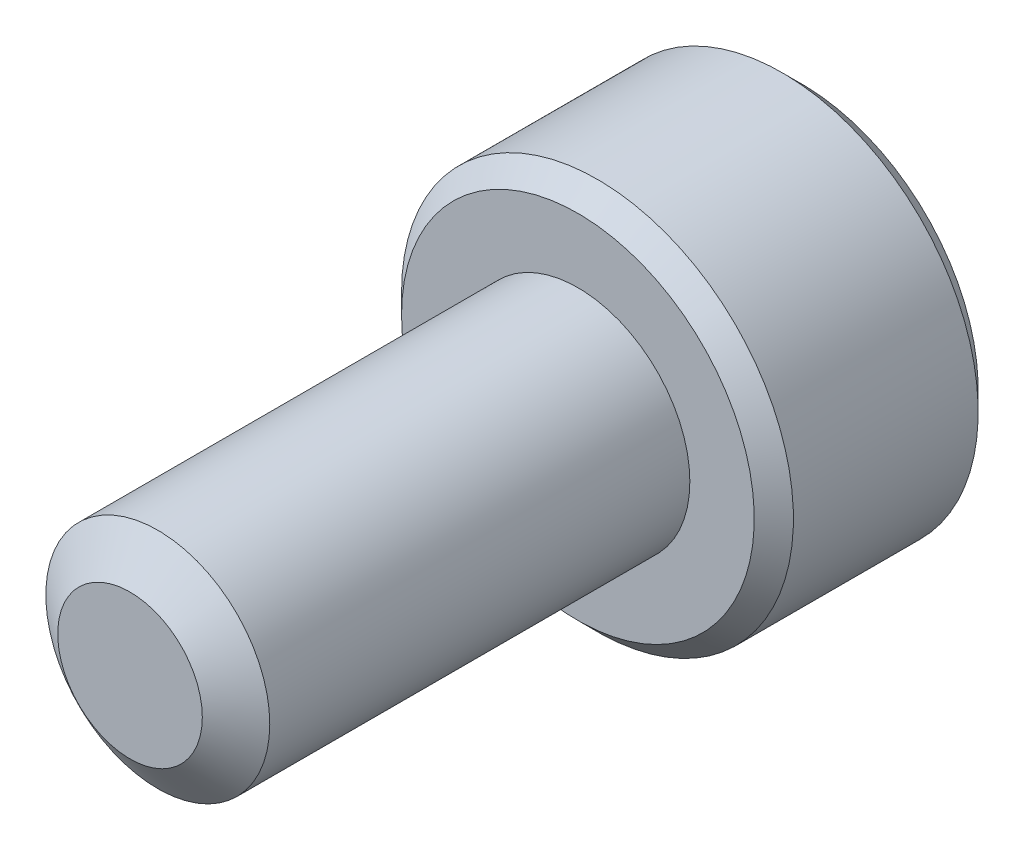
ISO-10303-21;
HEADER;
FILE_DESCRIPTION(('STEP AP214'),'2;1');
FILE_NAME('part.step','',(''),(''),'','','');
FILE_SCHEMA(('AUTOMOTIVE_DESIGN { 1 0 10303 214 1 1 1 1 }'));
ENDSEC;
DATA;
#1=APPLICATION_CONTEXT('core data for automotive mechanical design processes');
#2=APPLICATION_PROTOCOL_DEFINITION('international standard','automotive_design',2000,#1);
#3=PRODUCT_CONTEXT('',#1,'mechanical');
#4=PRODUCT('Part','Part','',(#3));
#5=PRODUCT_RELATED_PRODUCT_CATEGORY('part','',(#4));
#6=PRODUCT_DEFINITION_FORMATION('','',#4);
#7=PRODUCT_DEFINITION_CONTEXT('part definition',#1,'design');
#8=PRODUCT_DEFINITION('design','',#6,#7);
#9=PRODUCT_DEFINITION_SHAPE('','',#8);
#10=(LENGTH_UNIT() NAMED_UNIT(*) SI_UNIT(.MILLI.,.METRE.));
#11=(NAMED_UNIT(*) PLANE_ANGLE_UNIT() SI_UNIT($,.RADIAN.));
#12=(NAMED_UNIT(*) SI_UNIT($,.STERADIAN.) SOLID_ANGLE_UNIT());
#13=UNCERTAINTY_MEASURE_WITH_UNIT(LENGTH_MEASURE(1.E-05),#10,'distance_accuracy_value','');
#14=(GEOMETRIC_REPRESENTATION_CONTEXT(3) GLOBAL_UNCERTAINTY_ASSIGNED_CONTEXT((#13)) GLOBAL_UNIT_ASSIGNED_CONTEXT((#10,
#11,#12)) REPRESENTATION_CONTEXT('',''));
#15=CARTESIAN_POINT('',(0.,0.,0.));
#16=DIRECTION('',(0.,0.,1.));
#17=DIRECTION('',(1.,0.,0.));
#18=AXIS2_PLACEMENT_3D('',#15,#16,#17);
#19=CARTESIAN_POINT('',(0.,0.,-8.));
#20=DIRECTION('',(0.,0.,1.));
#21=DIRECTION('',(1.,0.,0.));
#22=AXIS2_PLACEMENT_3D('',#19,#20,#21);
#23=CYLINDRICAL_SURFACE('',#22,2.);
#24=CARTESIAN_POINT('',(0.,0.,-8.));
#25=DIRECTION('',(0.,0.,-1.));
#26=DIRECTION('',(-1.,0.,0.));
#27=AXIS2_PLACEMENT_3D('',#24,#25,#26);
#28=CIRCLE('',#27,2.);
#29=CARTESIAN_POINT('',(-2.,0.,-8.));
#30=VERTEX_POINT('',#29);
#31=EDGE_CURVE('E119',#30,#30,#28,.F.);
#32=ORIENTED_EDGE('',*,*,#31,.T.);
#33=EDGE_LOOP('',(#32));
#34=FACE_BOUND('',#33,.T.);
#35=CARTESIAN_POINT('',(0.,0.,-0.496211410611025));
#36=DIRECTION('',(0.,0.,1.));
#37=DIRECTION('',(1.,0.,0.));
#38=AXIS2_PLACEMENT_3D('',#35,#36,#37);
#39=CIRCLE('',#38,2.);
#40=CARTESIAN_POINT('',(2.,0.,-0.496211410611025));
#41=VERTEX_POINT('',#40);
#42=EDGE_CURVE('E130',#41,#41,#39,.T.);
#43=ORIENTED_EDGE('',*,*,#42,.F.);
#44=EDGE_LOOP('',(#43));
#45=FACE_BOUND('',#44,.T.);
#46=ADVANCED_FACE('F17',(#34,#45),#23,.T.);
#47=CARTESIAN_POINT('',(0.,0.,0.));
#48=DIRECTION('',(0.,0.,-1.));
#49=DIRECTION('',(-1.,0.,0.));
#50=AXIS2_PLACEMENT_3D('',#47,#48,#49);
#51=CONICAL_SURFACE('',#50,1.29133666301317,0.959931088596884);
#52=ORIENTED_EDGE('',*,*,#42,.T.);
#53=EDGE_LOOP('',(#52));
#54=FACE_BOUND('',#53,.T.);
#55=CARTESIAN_POINT('',(0.,0.,0.));
#56=DIRECTION('',(0.,0.,1.));
#57=DIRECTION('',(1.,0.,0.));
#58=AXIS2_PLACEMENT_3D('',#55,#56,#57);
#59=CIRCLE('',#58,1.29133666301317);
#60=CARTESIAN_POINT('',(1.29133666301317,0.,0.));
#61=VERTEX_POINT('',#60);
#62=EDGE_CURVE('E127',#61,#61,#59,.T.);
#63=ORIENTED_EDGE('',*,*,#62,.F.);
#64=EDGE_LOOP('',(#63));
#65=FACE_BOUND('',#64,.T.);
#66=ADVANCED_FACE('F175',(#54,#65),#51,.T.);
#67=CARTESIAN_POINT('',(0.,0.,0.));
#68=DIRECTION('',(0.,0.,1.));
#69=DIRECTION('',(1.,0.,0.));
#70=AXIS2_PLACEMENT_3D('',#67,#68,#69);
#71=PLANE('',#70);
#72=ORIENTED_EDGE('',*,*,#62,.T.);
#73=EDGE_LOOP('',(#72));
#74=FACE_BOUND('',#73,.T.);
#75=ADVANCED_FACE('F182',(#74),#71,.T.);
#76=CARTESIAN_POINT('',(0.,0.,-12.));
#77=DIRECTION('',(0.,0.,1.));
#78=DIRECTION('',(1.,0.,0.));
#79=AXIS2_PLACEMENT_3D('',#76,#77,#78);
#80=CYLINDRICAL_SURFACE('',#79,3.5);
#81=CARTESIAN_POINT('',(0.,0.,-11.65));
#82=DIRECTION('',(0.,0.,-1.));
#83=DIRECTION('',(-1.,0.,0.));
#84=AXIS2_PLACEMENT_3D('',#81,#82,#83);
#85=CIRCLE('',#84,3.5);
#86=CARTESIAN_POINT('',(-3.5,0.,-11.65));
#87=VERTEX_POINT('',#86);
#88=EDGE_CURVE('E25',#87,#87,#85,.F.);
#89=ORIENTED_EDGE('',*,*,#88,.T.);
#90=EDGE_LOOP('',(#89));
#91=FACE_BOUND('',#90,.T.);
#92=CARTESIAN_POINT('',(0.,0.,-8.35));
#93=DIRECTION('',(0.,0.,-1.));
#94=DIRECTION('',(-1.,0.,0.));
#95=AXIS2_PLACEMENT_3D('',#92,#93,#94);
#96=CIRCLE('',#95,3.5);
#97=CARTESIAN_POINT('',(-3.5,0.,-8.35));
#98=VERTEX_POINT('',#97);
#99=EDGE_CURVE('E136',#98,#98,#96,.T.);
#100=ORIENTED_EDGE('',*,*,#99,.T.);
#101=EDGE_LOOP('',(#100));
#102=FACE_BOUND('',#101,.T.);
#103=ADVANCED_FACE('F141',(#91,#102),#80,.T.);
#104=CARTESIAN_POINT('',(0.,0.,-12.));
#105=DIRECTION('',(0.,0.,-1.));
#106=DIRECTION('',(-1.,0.,0.));
#107=AXIS2_PLACEMENT_3D('',#104,#105,#106);
#108=PLANE('',#107);
#109=CARTESIAN_POINT('',(0.,0.,-12.));
#110=DIRECTION('',(0.,0.,-1.));
#111=DIRECTION('',(-1.,0.,0.));
#112=AXIS2_PLACEMENT_3D('',#109,#110,#111);
#113=CIRCLE('',#112,3.15);
#114=CARTESIAN_POINT('',(-3.15,0.,-12.));
#115=VERTEX_POINT('',#114);
#116=EDGE_CURVE('E133',#115,#115,#113,.T.);
#117=ORIENTED_EDGE('',*,*,#116,.T.);
#118=EDGE_LOOP('',(#117));
#119=FACE_BOUND('',#118,.T.);
#120=DIRECTION('',(0.866025403784439,0.5,0.));
#121=VECTOR('',#120,1.);
#122=CARTESIAN_POINT('',(-1.5,0.866025403784439,-12.));
#123=LINE('',#122,#121);
#124=CARTESIAN_POINT('',(-1.5,0.866025403784439,-12.));
#125=VERTEX_POINT('',#124);
#126=CARTESIAN_POINT('',(0.,1.73205080756888,-12.));
#127=VERTEX_POINT('',#126);
#128=EDGE_CURVE('E32',#125,#127,#123,.T.);
#129=ORIENTED_EDGE('',*,*,#128,.F.);
#130=DIRECTION('',(0.,1.,0.));
#131=VECTOR('',#130,1.);
#132=CARTESIAN_POINT('',(-1.5,-0.866025403784439,-12.));
#133=LINE('',#132,#131);
#134=CARTESIAN_POINT('',(-1.5,-0.866025403784439,-12.));
#135=VERTEX_POINT('',#134);
#136=EDGE_CURVE('E115',#135,#125,#133,.T.);
#137=ORIENTED_EDGE('',*,*,#136,.F.);
#138=DIRECTION('',(-0.866025403784439,0.5,0.));
#139=VECTOR('',#138,1.);
#140=CARTESIAN_POINT('',(0.,-1.73205080756887,-12.));
#141=LINE('',#140,#139);
#142=CARTESIAN_POINT('',(0.,-1.73205080756887,-12.));
#143=VERTEX_POINT('',#142);
#144=EDGE_CURVE('E113',#143,#135,#141,.T.);
#145=ORIENTED_EDGE('',*,*,#144,.F.);
#146=DIRECTION('',(-0.866025403784439,-0.5,0.));
#147=VECTOR('',#146,1.);
#148=CARTESIAN_POINT('',(1.5,-0.866025403784439,-12.));
#149=LINE('',#148,#147);
#150=CARTESIAN_POINT('',(1.5,-0.866025403784439,-12.));
#151=VERTEX_POINT('',#150);
#152=EDGE_CURVE('E80',#151,#143,#149,.T.);
#153=ORIENTED_EDGE('',*,*,#152,.F.);
#154=DIRECTION('',(0.,-1.,0.));
#155=VECTOR('',#154,1.);
#156=CARTESIAN_POINT('',(1.5,0.866025403784439,-12.));
#157=LINE('',#156,#155);
#158=CARTESIAN_POINT('',(1.5,0.866025403784439,-12.));
#159=VERTEX_POINT('',#158);
#160=EDGE_CURVE('E109',#159,#151,#157,.T.);
#161=ORIENTED_EDGE('',*,*,#160,.F.);
#162=DIRECTION('',(0.866025403784439,-0.5,0.));
#163=VECTOR('',#162,1.);
#164=CARTESIAN_POINT('',(0.,1.73205080756888,-12.));
#165=LINE('',#164,#163);
#166=EDGE_CURVE('E106',#127,#159,#165,.T.);
#167=ORIENTED_EDGE('',*,*,#166,.F.);
#168=EDGE_LOOP('',(#129,#137,#145,#153,#161,#167));
#169=FACE_BOUND('',#168,.T.);
#170=ADVANCED_FACE('F149',(#119,#169),#108,.T.);
#171=CARTESIAN_POINT('',(0.,0.,-8.));
#172=DIRECTION('',(0.,0.,-1.));
#173=DIRECTION('',(-1.,0.,0.));
#174=AXIS2_PLACEMENT_3D('',#171,#172,#173);
#175=PLANE('',#174);
#176=CARTESIAN_POINT('',(0.,0.,-8.));
#177=DIRECTION('',(0.,0.,-1.));
#178=DIRECTION('',(-1.,0.,0.));
#179=AXIS2_PLACEMENT_3D('',#176,#177,#178);
#180=CIRCLE('',#179,3.15);
#181=CARTESIAN_POINT('',(-3.15,0.,-8.));
#182=VERTEX_POINT('',#181);
#183=EDGE_CURVE('E11',#182,#182,#180,.F.);
#184=ORIENTED_EDGE('',*,*,#183,.T.);
#185=EDGE_LOOP('',(#184));
#186=FACE_BOUND('',#185,.T.);
#187=ORIENTED_EDGE('',*,*,#31,.F.);
#188=EDGE_LOOP('',(#187));
#189=FACE_BOUND('',#188,.T.);
#190=ADVANCED_FACE('F152',(#186,#189),#175,.F.);
#191=CARTESIAN_POINT('',(-1.5,0.866025403784439,-9.75));
#192=DIRECTION('',(-0.5,0.866025403784439,0.));
#193=DIRECTION('',(-0.866025403784439,-0.5,0.));
#194=AXIS2_PLACEMENT_3D('',#191,#192,#193);
#195=PLANE('',#194);
#196=ORIENTED_EDGE('',*,*,#128,.T.);
#197=DIRECTION('',(0.,0.,-1.));
#198=VECTOR('',#197,1.);
#199=CARTESIAN_POINT('',(0.,1.73205080756888,-9.75));
#200=LINE('',#199,#198);
#201=CARTESIAN_POINT('',(0.,1.73205080756888,-9.75));
#202=VERTEX_POINT('',#201);
#203=EDGE_CURVE('E62',#202,#127,#200,.T.);
#204=ORIENTED_EDGE('',*,*,#203,.F.);
#205=DIRECTION('',(0.866025403784439,0.5,0.));
#206=VECTOR('',#205,1.);
#207=CARTESIAN_POINT('',(-1.5,0.866025403784439,-9.75));
#208=LINE('',#207,#206);
#209=CARTESIAN_POINT('',(-1.5,0.866025403784439,-9.75));
#210=VERTEX_POINT('',#209);
#211=EDGE_CURVE('E117',#210,#202,#208,.T.);
#212=ORIENTED_EDGE('',*,*,#211,.F.);
#213=DIRECTION('',(0.,0.,-1.));
#214=VECTOR('',#213,1.);
#215=CARTESIAN_POINT('',(-1.5,0.866025403784439,-9.75));
#216=LINE('',#215,#214);
#217=EDGE_CURVE('E40',#210,#125,#216,.T.);
#218=ORIENTED_EDGE('',*,*,#217,.T.);
#219=EDGE_LOOP('',(#196,#204,#212,#218));
#220=FACE_BOUND('',#219,.T.);
#221=ADVANCED_FACE('F160',(#220),#195,.F.);
#222=CARTESIAN_POINT('',(-1.5,-0.866025403784439,-9.75));
#223=DIRECTION('',(-1.,0.,0.));
#224=DIRECTION('',(0.,-1.,0.));
#225=AXIS2_PLACEMENT_3D('',#222,#223,#224);
#226=PLANE('',#225);
#227=ORIENTED_EDGE('',*,*,#136,.T.);
#228=ORIENTED_EDGE('',*,*,#217,.F.);
#229=DIRECTION('',(0.,1.,0.));
#230=VECTOR('',#229,1.);
#231=CARTESIAN_POINT('',(-1.5,-0.866025403784439,-9.75));
#232=LINE('',#231,#230);
#233=CARTESIAN_POINT('',(-1.5,-0.866025403784439,-9.75));
#234=VERTEX_POINT('',#233);
#235=EDGE_CURVE('E92',#234,#210,#232,.T.);
#236=ORIENTED_EDGE('',*,*,#235,.F.);
#237=DIRECTION('',(0.,0.,-1.));
#238=VECTOR('',#237,1.);
#239=CARTESIAN_POINT('',(-1.5,-0.866025403784439,-9.75));
#240=LINE('',#239,#238);
#241=EDGE_CURVE('E84',#234,#135,#240,.T.);
#242=ORIENTED_EDGE('',*,*,#241,.T.);
#243=EDGE_LOOP('',(#227,#228,#236,#242));
#244=FACE_BOUND('',#243,.T.);
#245=ADVANCED_FACE('F162',(#244),#226,.F.);
#246=CARTESIAN_POINT('',(0.,-1.73205080756887,-9.75));
#247=DIRECTION('',(-0.5,-0.866025403784439,0.));
#248=DIRECTION('',(0.866025403784439,-0.5,0.));
#249=AXIS2_PLACEMENT_3D('',#246,#247,#248);
#250=PLANE('',#249);
#251=ORIENTED_EDGE('',*,*,#144,.T.);
#252=ORIENTED_EDGE('',*,*,#241,.F.);
#253=DIRECTION('',(-0.866025403784439,0.5,0.));
#254=VECTOR('',#253,1.);
#255=CARTESIAN_POINT('',(0.,-1.73205080756887,-9.75));
#256=LINE('',#255,#254);
#257=CARTESIAN_POINT('',(0.,-1.73205080756887,-9.75));
#258=VERTEX_POINT('',#257);
#259=EDGE_CURVE('E88',#258,#234,#256,.T.);
#260=ORIENTED_EDGE('',*,*,#259,.F.);
#261=DIRECTION('',(0.,0.,-1.));
#262=VECTOR('',#261,1.);
#263=CARTESIAN_POINT('',(0.,-1.73205080756887,-9.75));
#264=LINE('',#263,#262);
#265=EDGE_CURVE('E73',#258,#143,#264,.T.);
#266=ORIENTED_EDGE('',*,*,#265,.T.);
#267=EDGE_LOOP('',(#251,#252,#260,#266));
#268=FACE_BOUND('',#267,.T.);
#269=ADVANCED_FACE('F89',(#268),#250,.F.);
#270=CARTESIAN_POINT('',(1.5,-0.866025403784439,-9.75));
#271=DIRECTION('',(0.5,-0.866025403784439,0.));
#272=DIRECTION('',(0.866025403784439,0.5,0.));
#273=AXIS2_PLACEMENT_3D('',#270,#271,#272);
#274=PLANE('',#273);
#275=ORIENTED_EDGE('',*,*,#152,.T.);
#276=ORIENTED_EDGE('',*,*,#265,.F.);
#277=DIRECTION('',(-0.866025403784439,-0.5,0.));
#278=VECTOR('',#277,1.);
#279=CARTESIAN_POINT('',(1.5,-0.866025403784439,-9.75));
#280=LINE('',#279,#278);
#281=CARTESIAN_POINT('',(1.5,-0.866025403784439,-9.75));
#282=VERTEX_POINT('',#281);
#283=EDGE_CURVE('E77',#282,#258,#280,.T.);
#284=ORIENTED_EDGE('',*,*,#283,.F.);
#285=DIRECTION('',(0.,0.,-1.));
#286=VECTOR('',#285,1.);
#287=CARTESIAN_POINT('',(1.5,-0.866025403784439,-9.75));
#288=LINE('',#287,#286);
#289=EDGE_CURVE('E85',#282,#151,#288,.T.);
#290=ORIENTED_EDGE('',*,*,#289,.T.);
#291=EDGE_LOOP('',(#275,#276,#284,#290));
#292=FACE_BOUND('',#291,.T.);
#293=ADVANCED_FACE('F75',(#292),#274,.F.);
#294=CARTESIAN_POINT('',(1.5,0.866025403784439,-9.75));
#295=DIRECTION('',(1.,0.,0.));
#296=DIRECTION('',(0.,0.,-1.));
#297=AXIS2_PLACEMENT_3D('',#294,#295,#296);
#298=PLANE('',#297);
#299=ORIENTED_EDGE('',*,*,#160,.T.);
#300=ORIENTED_EDGE('',*,*,#289,.F.);
#301=DIRECTION('',(0.,-1.,0.));
#302=VECTOR('',#301,1.);
#303=CARTESIAN_POINT('',(1.5,0.866025403784439,-9.75));
#304=LINE('',#303,#302);
#305=CARTESIAN_POINT('',(1.5,0.866025403784439,-9.75));
#306=VERTEX_POINT('',#305);
#307=EDGE_CURVE('E98',#306,#282,#304,.T.);
#308=ORIENTED_EDGE('',*,*,#307,.F.);
#309=DIRECTION('',(0.,0.,-1.));
#310=VECTOR('',#309,1.);
#311=CARTESIAN_POINT('',(1.5,0.866025403784439,-9.75));
#312=LINE('',#311,#310);
#313=EDGE_CURVE('E122',#306,#159,#312,.T.);
#314=ORIENTED_EDGE('',*,*,#313,.T.);
#315=EDGE_LOOP('',(#299,#300,#308,#314));
#316=FACE_BOUND('',#315,.T.);
#317=ADVANCED_FACE('F238',(#316),#298,.F.);
#318=CARTESIAN_POINT('',(0.,1.73205080756888,-9.75));
#319=DIRECTION('',(0.5,0.866025403784439,0.));
#320=DIRECTION('',(-0.866025403784439,0.5,0.));
#321=AXIS2_PLACEMENT_3D('',#318,#319,#320);
#322=PLANE('',#321);
#323=ORIENTED_EDGE('',*,*,#166,.T.);
#324=ORIENTED_EDGE('',*,*,#313,.F.);
#325=DIRECTION('',(0.866025403784439,-0.5,0.));
#326=VECTOR('',#325,1.);
#327=CARTESIAN_POINT('',(0.,1.73205080756888,-9.75));
#328=LINE('',#327,#326);
#329=EDGE_CURVE('E100',#202,#306,#328,.T.);
#330=ORIENTED_EDGE('',*,*,#329,.F.);
#331=ORIENTED_EDGE('',*,*,#203,.T.);
#332=EDGE_LOOP('',(#323,#324,#330,#331));
#333=FACE_BOUND('',#332,.T.);
#334=ADVANCED_FACE('F158',(#333),#322,.F.);
#335=CARTESIAN_POINT('',(1.5,2.59807621135332,-9.75));
#336=DIRECTION('',(0.,0.,-1.));
#337=DIRECTION('',(-1.,0.,0.));
#338=AXIS2_PLACEMENT_3D('',#335,#336,#337);
#339=PLANE('',#338);
#340=ORIENTED_EDGE('',*,*,#211,.T.);
#341=ORIENTED_EDGE('',*,*,#329,.T.);
#342=ORIENTED_EDGE('',*,*,#307,.T.);
#343=ORIENTED_EDGE('',*,*,#283,.T.);
#344=ORIENTED_EDGE('',*,*,#259,.T.);
#345=ORIENTED_EDGE('',*,*,#235,.T.);
#346=EDGE_LOOP('',(#340,#341,#342,#343,#344,#345));
#347=FACE_BOUND('',#346,.T.);
#348=ADVANCED_FACE('F95',(#347),#339,.T.);
#349=CARTESIAN_POINT('',(0.,0.,-12.));
#350=DIRECTION('',(0.,0.,1.));
#351=DIRECTION('',(1.,0.,0.));
#352=AXIS2_PLACEMENT_3D('',#349,#350,#351);
#353=CONICAL_SURFACE('',#352,3.15,0.785398163397447);
#354=ORIENTED_EDGE('',*,*,#88,.F.);
#355=EDGE_LOOP('',(#354));
#356=FACE_BOUND('',#355,.T.);
#357=ORIENTED_EDGE('',*,*,#116,.F.);
#358=EDGE_LOOP('',(#357));
#359=FACE_BOUND('',#358,.T.);
#360=ADVANCED_FACE('F144',(#356,#359),#353,.T.);
#361=CARTESIAN_POINT('',(0.,0.,-8.35));
#362=DIRECTION('',(0.,0.,-1.));
#363=DIRECTION('',(-1.,0.,0.));
#364=AXIS2_PLACEMENT_3D('',#361,#362,#363);
#365=CONICAL_SURFACE('',#364,3.5,0.785398163397449);
#366=ORIENTED_EDGE('',*,*,#183,.F.);
#367=EDGE_LOOP('',(#366));
#368=FACE_BOUND('',#367,.T.);
#369=ORIENTED_EDGE('',*,*,#99,.F.);
#370=EDGE_LOOP('',(#369));
#371=FACE_BOUND('',#370,.T.);
#372=ADVANCED_FACE('F19',(#368,#371),#365,.T.);
#373=CLOSED_SHELL('',(#46,#66,#75,#103,#170,#190,#221,#245,#269,#293,#317,#334,#348,#360,#372));
#374=MANIFOLD_SOLID_BREP('B1',#373);
#375=ADVANCED_BREP_SHAPE_REPRESENTATION('',(#18,#374),#14);
#376=SHAPE_DEFINITION_REPRESENTATION(#9,#375);
ENDSEC;
END-ISO-10303-21;
